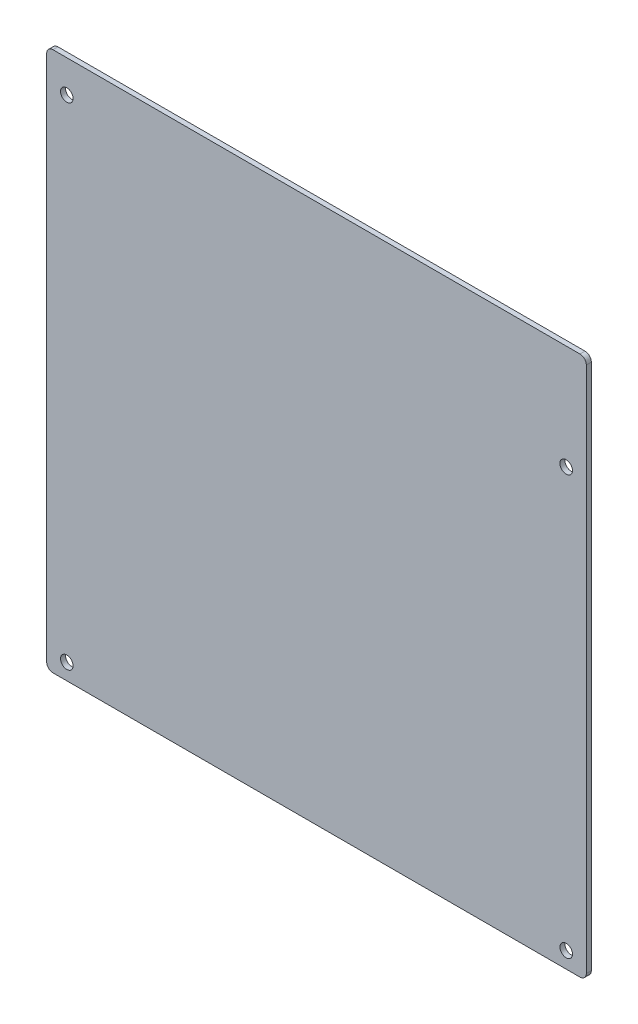
ISO-10303-21;
HEADER;
FILE_DESCRIPTION(('STEP AP214'),'2;1');
FILE_NAME('part.step','',(''),(''),'','','');
FILE_SCHEMA(('AUTOMOTIVE_DESIGN { 1 0 10303 214 1 1 1 1 }'));
ENDSEC;
DATA;
#1=APPLICATION_CONTEXT('core data for automotive mechanical design processes');
#2=APPLICATION_PROTOCOL_DEFINITION('international standard','automotive_design',2000,#1);
#3=PRODUCT_CONTEXT('',#1,'mechanical');
#4=PRODUCT('Part','Part','',(#3));
#5=PRODUCT_RELATED_PRODUCT_CATEGORY('part','',(#4));
#6=PRODUCT_DEFINITION_FORMATION('','',#4);
#7=PRODUCT_DEFINITION_CONTEXT('part definition',#1,'design');
#8=PRODUCT_DEFINITION('design','',#6,#7);
#9=PRODUCT_DEFINITION_SHAPE('','',#8);
#10=(LENGTH_UNIT() NAMED_UNIT(*) SI_UNIT(.MILLI.,.METRE.));
#11=(NAMED_UNIT(*) PLANE_ANGLE_UNIT() SI_UNIT($,.RADIAN.));
#12=(NAMED_UNIT(*) SI_UNIT($,.STERADIAN.) SOLID_ANGLE_UNIT());
#13=UNCERTAINTY_MEASURE_WITH_UNIT(LENGTH_MEASURE(1.E-05),#10,'distance_accuracy_value','');
#14=(GEOMETRIC_REPRESENTATION_CONTEXT(3) GLOBAL_UNCERTAINTY_ASSIGNED_CONTEXT((#13)) GLOBAL_UNIT_ASSIGNED_CONTEXT((#10,
#11,#12)) REPRESENTATION_CONTEXT('',''));
#15=CARTESIAN_POINT('',(0.,0.,0.));
#16=DIRECTION('',(0.,0.,1.));
#17=DIRECTION('',(1.,0.,0.));
#18=AXIS2_PLACEMENT_3D('',#15,#16,#17);
#19=CARTESIAN_POINT('',(-4.34999999999997,-3.08000000000002,-242.245864044653));
#20=DIRECTION('',(0.,0.,1.));
#21=DIRECTION('',(1.,0.,0.));
#22=AXIS2_PLACEMENT_3D('',#19,#20,#21);
#23=CYLINDRICAL_SURFACE('',#22,2.00000000000001);
#24=CARTESIAN_POINT('',(-4.34999999999997,-3.08000000000002,-1.57500000000005));
#25=DIRECTION('',(0.,0.,1.));
#26=DIRECTION('',(1.,0.,0.));
#27=AXIS2_PLACEMENT_3D('',#24,#25,#26);
#28=CIRCLE('',#27,2.00000000000001);
#29=CARTESIAN_POINT('',(-4.34999999999997,-5.08000000000002,-1.57500000000005));
#30=VERTEX_POINT('',#29);
#31=CARTESIAN_POINT('',(-6.34999999999998,-3.08000000000003,-1.57500000000005));
#32=VERTEX_POINT('',#31);
#33=EDGE_CURVE('E44',#30,#32,#28,.F.);
#34=ORIENTED_EDGE('',*,*,#33,.F.);
#35=DIRECTION('',(0.,0.,1.));
#36=VECTOR('',#35,1.);
#37=CARTESIAN_POINT('',(-4.34999999999997,-5.08000000000002,-242.245864044653));
#38=LINE('',#37,#36);
#39=CARTESIAN_POINT('',(-4.34999999999997,-5.08000000000002,0.));
#40=VERTEX_POINT('',#39);
#41=EDGE_CURVE('E119',#30,#40,#38,.T.);
#42=ORIENTED_EDGE('',*,*,#41,.T.);
#43=CARTESIAN_POINT('',(-4.34999999999997,-3.08000000000002,0.));
#44=DIRECTION('',(0.,0.,1.));
#45=DIRECTION('',(-1.,0.,0.));
#46=AXIS2_PLACEMENT_3D('',#43,#44,#45);
#47=CIRCLE('',#46,2.00000000000001);
#48=CARTESIAN_POINT('',(-6.34999999999998,-3.08000000000002,0.));
#49=VERTEX_POINT('',#48);
#50=EDGE_CURVE('E134',#49,#40,#47,.T.);
#51=ORIENTED_EDGE('',*,*,#50,.F.);
#52=DIRECTION('',(0.,0.,1.));
#53=VECTOR('',#52,1.);
#54=CARTESIAN_POINT('',(-6.34999999999998,-3.08000000000002,-242.245864044653));
#55=LINE('',#54,#53);
#56=EDGE_CURVE('E105',#32,#49,#55,.T.);
#57=ORIENTED_EDGE('',*,*,#56,.F.);
#58=EDGE_LOOP('',(#34,#42,#51,#57));
#59=FACE_BOUND('',#58,.T.);
#60=ADVANCED_FACE('F36',(#59),#23,.T.);
#61=CARTESIAN_POINT('',(-6.35,163.1,-242.245864044653));
#62=DIRECTION('',(-1.,0.,0.));
#63=DIRECTION('',(0.,-1.,0.));
#64=AXIS2_PLACEMENT_3D('',#61,#62,#63);
#65=PLANE('',#64);
#66=DIRECTION('',(0.,1.,0.));
#67=VECTOR('',#66,1.);
#68=CARTESIAN_POINT('',(-6.35,163.1,-1.57500000000005));
#69=LINE('',#68,#67);
#70=CARTESIAN_POINT('',(-6.35,163.1,-1.57500000000005));
#71=VERTEX_POINT('',#70);
#72=EDGE_CURVE('E82',#32,#71,#69,.T.);
#73=ORIENTED_EDGE('',*,*,#72,.F.);
#74=ORIENTED_EDGE('',*,*,#56,.T.);
#75=DIRECTION('',(0.,-1.,0.));
#76=VECTOR('',#75,1.);
#77=CARTESIAN_POINT('',(-6.35,163.1,0.));
#78=LINE('',#77,#76);
#79=CARTESIAN_POINT('',(-6.35,163.1,0.));
#80=VERTEX_POINT('',#79);
#81=EDGE_CURVE('E121',#80,#49,#78,.T.);
#82=ORIENTED_EDGE('',*,*,#81,.F.);
#83=DIRECTION('',(0.,0.,1.));
#84=VECTOR('',#83,1.);
#85=CARTESIAN_POINT('',(-6.35,163.1,-242.245864044653));
#86=LINE('',#85,#84);
#87=EDGE_CURVE('E103',#71,#80,#86,.T.);
#88=ORIENTED_EDGE('',*,*,#87,.F.);
#89=EDGE_LOOP('',(#73,#74,#82,#88));
#90=FACE_BOUND('',#89,.T.);
#91=ADVANCED_FACE('F205',(#90),#65,.T.);
#92=CARTESIAN_POINT('',(-4.35,163.1,-242.245864044653));
#93=DIRECTION('',(0.,0.,1.));
#94=DIRECTION('',(1.,0.,0.));
#95=AXIS2_PLACEMENT_3D('',#92,#93,#94);
#96=CYLINDRICAL_SURFACE('',#95,2.);
#97=CARTESIAN_POINT('',(-4.35,163.1,-1.57500000000005));
#98=DIRECTION('',(0.,0.,1.));
#99=DIRECTION('',(1.,0.,0.));
#100=AXIS2_PLACEMENT_3D('',#97,#98,#99);
#101=CIRCLE('',#100,2.);
#102=CARTESIAN_POINT('',(-4.34999999999999,165.1,-1.57500000000005));
#103=VERTEX_POINT('',#102);
#104=EDGE_CURVE('E78',#71,#103,#101,.F.);
#105=ORIENTED_EDGE('',*,*,#104,.F.);
#106=ORIENTED_EDGE('',*,*,#87,.T.);
#107=CARTESIAN_POINT('',(-4.35,163.1,0.));
#108=DIRECTION('',(0.,0.,1.));
#109=DIRECTION('',(1.,0.,0.));
#110=AXIS2_PLACEMENT_3D('',#107,#108,#109);
#111=CIRCLE('',#110,2.);
#112=CARTESIAN_POINT('',(-4.34999999999999,165.1,0.));
#113=VERTEX_POINT('',#112);
#114=EDGE_CURVE('E101',#113,#80,#111,.T.);
#115=ORIENTED_EDGE('',*,*,#114,.F.);
#116=DIRECTION('',(0.,0.,1.));
#117=VECTOR('',#116,1.);
#118=CARTESIAN_POINT('',(-4.34999999999999,165.1,-242.245864044653));
#119=LINE('',#118,#117);
#120=EDGE_CURVE('E94',#103,#113,#119,.T.);
#121=ORIENTED_EDGE('',*,*,#120,.F.);
#122=EDGE_LOOP('',(#105,#106,#115,#121));
#123=FACE_BOUND('',#122,.T.);
#124=ADVANCED_FACE('F99',(#123),#96,.T.);
#125=CARTESIAN_POINT('',(161.83,165.1,-242.245864044653));
#126=DIRECTION('',(0.,1.,0.));
#127=DIRECTION('',(0.,0.,1.));
#128=AXIS2_PLACEMENT_3D('',#125,#126,#127);
#129=PLANE('',#128);
#130=DIRECTION('',(1.,0.,0.));
#131=VECTOR('',#130,1.);
#132=CARTESIAN_POINT('',(161.83,165.1,-1.57500000000005));
#133=LINE('',#132,#131);
#134=CARTESIAN_POINT('',(161.83,165.1,-1.57500000000005));
#135=VERTEX_POINT('',#134);
#136=EDGE_CURVE('E81',#103,#135,#133,.T.);
#137=ORIENTED_EDGE('',*,*,#136,.F.);
#138=ORIENTED_EDGE('',*,*,#120,.T.);
#139=DIRECTION('',(-1.,0.,0.));
#140=VECTOR('',#139,1.);
#141=CARTESIAN_POINT('',(161.83,165.1,0.));
#142=LINE('',#141,#140);
#143=CARTESIAN_POINT('',(161.83,165.1,0.));
#144=VERTEX_POINT('',#143);
#145=EDGE_CURVE('E158',#144,#113,#142,.T.);
#146=ORIENTED_EDGE('',*,*,#145,.F.);
#147=DIRECTION('',(0.,0.,1.));
#148=VECTOR('',#147,1.);
#149=CARTESIAN_POINT('',(161.83,165.1,-242.245864044653));
#150=LINE('',#149,#148);
#151=EDGE_CURVE('E97',#135,#144,#150,.T.);
#152=ORIENTED_EDGE('',*,*,#151,.F.);
#153=EDGE_LOOP('',(#137,#138,#146,#152));
#154=FACE_BOUND('',#153,.T.);
#155=ADVANCED_FACE('F91',(#154),#129,.T.);
#156=CARTESIAN_POINT('',(161.83,163.1,-242.245864044653));
#157=DIRECTION('',(0.,0.,1.));
#158=DIRECTION('',(1.,0.,0.));
#159=AXIS2_PLACEMENT_3D('',#156,#157,#158);
#160=CYLINDRICAL_SURFACE('',#159,2.);
#161=CARTESIAN_POINT('',(161.83,163.1,-1.57500000000005));
#162=DIRECTION('',(0.,0.,1.));
#163=DIRECTION('',(1.,0.,0.));
#164=AXIS2_PLACEMENT_3D('',#161,#162,#163);
#165=CIRCLE('',#164,2.);
#166=CARTESIAN_POINT('',(163.83,163.1,-1.57500000000005));
#167=VERTEX_POINT('',#166);
#168=EDGE_CURVE('E58',#135,#167,#165,.F.);
#169=ORIENTED_EDGE('',*,*,#168,.F.);
#170=ORIENTED_EDGE('',*,*,#151,.T.);
#171=CARTESIAN_POINT('',(161.83,163.1,0.));
#172=DIRECTION('',(0.,0.,1.));
#173=DIRECTION('',(-1.,0.,0.));
#174=AXIS2_PLACEMENT_3D('',#171,#172,#173);
#175=CIRCLE('',#174,2.);
#176=CARTESIAN_POINT('',(163.83,163.1,0.));
#177=VERTEX_POINT('',#176);
#178=EDGE_CURVE('E155',#177,#144,#175,.T.);
#179=ORIENTED_EDGE('',*,*,#178,.F.);
#180=DIRECTION('',(0.,0.,1.));
#181=VECTOR('',#180,1.);
#182=CARTESIAN_POINT('',(163.83,163.1,-242.245864044653));
#183=LINE('',#182,#181);
#184=EDGE_CURVE('E107',#167,#177,#183,.T.);
#185=ORIENTED_EDGE('',*,*,#184,.F.);
#186=EDGE_LOOP('',(#169,#170,#179,#185));
#187=FACE_BOUND('',#186,.T.);
#188=ADVANCED_FACE('F231',(#187),#160,.T.);
#189=CARTESIAN_POINT('',(163.83,163.1,-242.245864044653));
#190=DIRECTION('',(1.,0.,0.));
#191=DIRECTION('',(0.,1.,0.));
#192=AXIS2_PLACEMENT_3D('',#189,#190,#191);
#193=PLANE('',#192);
#194=DIRECTION('',(0.,-1.,0.));
#195=VECTOR('',#194,1.);
#196=CARTESIAN_POINT('',(163.83,163.1,-1.57500000000005));
#197=LINE('',#196,#195);
#198=CARTESIAN_POINT('',(163.83,-3.08,-1.57500000000005));
#199=VERTEX_POINT('',#198);
#200=EDGE_CURVE('E52',#167,#199,#197,.T.);
#201=ORIENTED_EDGE('',*,*,#200,.F.);
#202=ORIENTED_EDGE('',*,*,#184,.T.);
#203=DIRECTION('',(0.,1.,0.));
#204=VECTOR('',#203,1.);
#205=CARTESIAN_POINT('',(163.83,163.1,0.));
#206=LINE('',#205,#204);
#207=CARTESIAN_POINT('',(163.83,-3.08,0.));
#208=VERTEX_POINT('',#207);
#209=EDGE_CURVE('E152',#208,#177,#206,.T.);
#210=ORIENTED_EDGE('',*,*,#209,.F.);
#211=DIRECTION('',(0.,0.,1.));
#212=VECTOR('',#211,1.);
#213=CARTESIAN_POINT('',(163.83,-3.08,-242.245864044653));
#214=LINE('',#213,#212);
#215=EDGE_CURVE('E113',#199,#208,#214,.T.);
#216=ORIENTED_EDGE('',*,*,#215,.F.);
#217=EDGE_LOOP('',(#201,#202,#210,#216));
#218=FACE_BOUND('',#217,.T.);
#219=ADVANCED_FACE('F233',(#218),#193,.T.);
#220=CARTESIAN_POINT('',(161.83,-3.08,-242.245864044653));
#221=DIRECTION('',(0.,0.,1.));
#222=DIRECTION('',(1.,0.,0.));
#223=AXIS2_PLACEMENT_3D('',#220,#221,#222);
#224=CYLINDRICAL_SURFACE('',#223,2.);
#225=CARTESIAN_POINT('',(161.83,-3.08,-1.57500000000005));
#226=DIRECTION('',(0.,0.,1.));
#227=DIRECTION('',(1.,0.,0.));
#228=AXIS2_PLACEMENT_3D('',#225,#226,#227);
#229=CIRCLE('',#228,2.);
#230=CARTESIAN_POINT('',(161.83,-5.08,-1.5750000000001));
#231=VERTEX_POINT('',#230);
#232=EDGE_CURVE('E162',#199,#231,#229,.F.);
#233=ORIENTED_EDGE('',*,*,#232,.F.);
#234=ORIENTED_EDGE('',*,*,#215,.T.);
#235=CARTESIAN_POINT('',(161.83,-3.08,0.));
#236=DIRECTION('',(0.,0.,1.));
#237=DIRECTION('',(-1.,0.,0.));
#238=AXIS2_PLACEMENT_3D('',#235,#236,#237);
#239=CIRCLE('',#238,2.);
#240=CARTESIAN_POINT('',(161.83,-5.08,0.));
#241=VERTEX_POINT('',#240);
#242=EDGE_CURVE('E145',#241,#208,#239,.T.);
#243=ORIENTED_EDGE('',*,*,#242,.F.);
#244=DIRECTION('',(0.,0.,1.));
#245=VECTOR('',#244,1.);
#246=CARTESIAN_POINT('',(161.83,-5.08,-242.245864044653));
#247=LINE('',#246,#245);
#248=EDGE_CURVE('E116',#231,#241,#247,.T.);
#249=ORIENTED_EDGE('',*,*,#248,.F.);
#250=EDGE_LOOP('',(#233,#234,#243,#249));
#251=FACE_BOUND('',#250,.T.);
#252=ADVANCED_FACE('F236',(#251),#224,.T.);
#253=CARTESIAN_POINT('',(161.83,-5.08,-242.245864044653));
#254=DIRECTION('',(0.,-1.,0.));
#255=DIRECTION('',(1.,0.,0.));
#256=AXIS2_PLACEMENT_3D('',#253,#254,#255);
#257=PLANE('',#256);
#258=DIRECTION('',(-1.,0.,0.));
#259=VECTOR('',#258,1.);
#260=CARTESIAN_POINT('',(161.83,-5.08,-1.57500000000005));
#261=LINE('',#260,#259);
#262=EDGE_CURVE('E11',#231,#30,#261,.T.);
#263=ORIENTED_EDGE('',*,*,#262,.F.);
#264=ORIENTED_EDGE('',*,*,#248,.T.);
#265=DIRECTION('',(1.,0.,0.));
#266=VECTOR('',#265,1.);
#267=CARTESIAN_POINT('',(161.83,-5.08,0.));
#268=LINE('',#267,#266);
#269=EDGE_CURVE('E138',#40,#241,#268,.T.);
#270=ORIENTED_EDGE('',*,*,#269,.F.);
#271=ORIENTED_EDGE('',*,*,#41,.F.);
#272=EDGE_LOOP('',(#263,#264,#270,#271));
#273=FACE_BOUND('',#272,.T.);
#274=ADVANCED_FACE('F189',(#273),#257,.T.);
#275=CARTESIAN_POINT('',(-4.34999999999997,-3.08000000000002,0.));
#276=DIRECTION('',(0.,0.,-1.));
#277=DIRECTION('',(-1.,0.,0.));
#278=AXIS2_PLACEMENT_3D('',#275,#276,#277);
#279=PLANE('',#278);
#280=CARTESIAN_POINT('',(0.,154.9199999892,0.));
#281=DIRECTION('',(0.,0.,1.));
#282=DIRECTION('',(1.,0.,0.));
#283=AXIS2_PLACEMENT_3D('',#280,#281,#282);
#284=CIRCLE('',#283,1.9749999997);
#285=CARTESIAN_POINT('',(1.9749999997,154.9199999892,0.));
#286=VERTEX_POINT('',#285);
#287=EDGE_CURVE('E174',#286,#286,#284,.T.);
#288=ORIENTED_EDGE('',*,*,#287,.F.);
#289=EDGE_LOOP('',(#288));
#290=FACE_BOUND('',#289,.T.);
#291=CARTESIAN_POINT('',(157.48,132.08,0.));
#292=DIRECTION('',(0.,0.,1.));
#293=DIRECTION('',(1.,0.,0.));
#294=AXIS2_PLACEMENT_3D('',#291,#292,#293);
#295=CIRCLE('',#294,1.97499999969999);
#296=CARTESIAN_POINT('',(159.4549999997,132.08,0.));
#297=VERTEX_POINT('',#296);
#298=EDGE_CURVE('E177',#297,#297,#295,.T.);
#299=ORIENTED_EDGE('',*,*,#298,.F.);
#300=EDGE_LOOP('',(#299));
#301=FACE_BOUND('',#300,.T.);
#302=CARTESIAN_POINT('',(157.48,0.,0.));
#303=DIRECTION('',(0.,0.,1.));
#304=DIRECTION('',(1.,0.,0.));
#305=AXIS2_PLACEMENT_3D('',#302,#303,#304);
#306=CIRCLE('',#305,1.97499999969999);
#307=CARTESIAN_POINT('',(159.4549999997,0.,0.));
#308=VERTEX_POINT('',#307);
#309=EDGE_CURVE('E173',#308,#308,#306,.T.);
#310=ORIENTED_EDGE('',*,*,#309,.F.);
#311=EDGE_LOOP('',(#310));
#312=FACE_BOUND('',#311,.T.);
#313=CARTESIAN_POINT('',(0.,0.,0.));
#314=DIRECTION('',(0.,0.,1.));
#315=DIRECTION('',(1.,0.,0.));
#316=AXIS2_PLACEMENT_3D('',#313,#314,#315);
#317=CIRCLE('',#316,1.9749999997);
#318=CARTESIAN_POINT('',(1.9749999997,0.,0.));
#319=VERTEX_POINT('',#318);
#320=EDGE_CURVE('E127',#319,#319,#317,.T.);
#321=ORIENTED_EDGE('',*,*,#320,.F.);
#322=EDGE_LOOP('',(#321));
#323=FACE_BOUND('',#322,.T.);
#324=ORIENTED_EDGE('',*,*,#50,.T.);
#325=ORIENTED_EDGE('',*,*,#269,.T.);
#326=ORIENTED_EDGE('',*,*,#242,.T.);
#327=ORIENTED_EDGE('',*,*,#209,.T.);
#328=ORIENTED_EDGE('',*,*,#178,.T.);
#329=ORIENTED_EDGE('',*,*,#145,.T.);
#330=ORIENTED_EDGE('',*,*,#114,.T.);
#331=ORIENTED_EDGE('',*,*,#81,.T.);
#332=EDGE_LOOP('',(#324,#325,#326,#327,#328,#329,#330,#331));
#333=FACE_BOUND('',#332,.T.);
#334=ADVANCED_FACE('F186',(#290,#301,#312,#323,#333),#279,.F.);
#335=CARTESIAN_POINT('',(0.,0.,-1.57500000000005));
#336=DIRECTION('',(0.,0.,1.));
#337=DIRECTION('',(1.,0.,0.));
#338=AXIS2_PLACEMENT_3D('',#335,#336,#337);
#339=PLANE('',#338);
#340=CARTESIAN_POINT('',(0.,154.9199999892,-1.57500000000005));
#341=DIRECTION('',(0.,0.,1.));
#342=DIRECTION('',(1.,0.,0.));
#343=AXIS2_PLACEMENT_3D('',#340,#341,#342);
#344=CIRCLE('',#343,1.9749999997);
#345=CARTESIAN_POINT('',(1.9749999997,154.9199999892,-1.57500000000005));
#346=VERTEX_POINT('',#345);
#347=EDGE_CURVE('E39',#346,#346,#344,.T.);
#348=ORIENTED_EDGE('',*,*,#347,.T.);
#349=EDGE_LOOP('',(#348));
#350=FACE_BOUND('',#349,.T.);
#351=CARTESIAN_POINT('',(157.48,132.08,-1.57500000000005));
#352=DIRECTION('',(0.,0.,1.));
#353=DIRECTION('',(1.,0.,0.));
#354=AXIS2_PLACEMENT_3D('',#351,#352,#353);
#355=CIRCLE('',#354,1.97499999969999);
#356=CARTESIAN_POINT('',(159.4549999997,132.08,-1.57500000000005));
#357=VERTEX_POINT('',#356);
#358=EDGE_CURVE('E129',#357,#357,#355,.T.);
#359=ORIENTED_EDGE('',*,*,#358,.T.);
#360=EDGE_LOOP('',(#359));
#361=FACE_BOUND('',#360,.T.);
#362=CARTESIAN_POINT('',(157.48,0.,-1.57500000000005));
#363=DIRECTION('',(0.,0.,1.));
#364=DIRECTION('',(1.,0.,0.));
#365=AXIS2_PLACEMENT_3D('',#362,#363,#364);
#366=CIRCLE('',#365,1.97499999969999);
#367=CARTESIAN_POINT('',(159.4549999997,0.,-1.57500000000005));
#368=VERTEX_POINT('',#367);
#369=EDGE_CURVE('E126',#368,#368,#366,.T.);
#370=ORIENTED_EDGE('',*,*,#369,.T.);
#371=EDGE_LOOP('',(#370));
#372=FACE_BOUND('',#371,.T.);
#373=CARTESIAN_POINT('',(0.,0.,-1.57500000000005));
#374=DIRECTION('',(0.,0.,1.));
#375=DIRECTION('',(1.,0.,0.));
#376=AXIS2_PLACEMENT_3D('',#373,#374,#375);
#377=CIRCLE('',#376,1.9749999997);
#378=CARTESIAN_POINT('',(1.9749999997,0.,-1.57500000000005));
#379=VERTEX_POINT('',#378);
#380=EDGE_CURVE('E123',#379,#379,#377,.T.);
#381=ORIENTED_EDGE('',*,*,#380,.T.);
#382=EDGE_LOOP('',(#381));
#383=FACE_BOUND('',#382,.T.);
#384=ORIENTED_EDGE('',*,*,#33,.T.);
#385=ORIENTED_EDGE('',*,*,#72,.T.);
#386=ORIENTED_EDGE('',*,*,#104,.T.);
#387=ORIENTED_EDGE('',*,*,#136,.T.);
#388=ORIENTED_EDGE('',*,*,#168,.T.);
#389=ORIENTED_EDGE('',*,*,#200,.T.);
#390=ORIENTED_EDGE('',*,*,#232,.T.);
#391=ORIENTED_EDGE('',*,*,#262,.T.);
#392=EDGE_LOOP('',(#384,#385,#386,#387,#388,#389,#390,#391));
#393=FACE_BOUND('',#392,.T.);
#394=ADVANCED_FACE('F80',(#350,#361,#372,#383,#393),#339,.F.);
#395=CARTESIAN_POINT('',(0.,0.,-10.));
#396=DIRECTION('',(0.,0.,1.));
#397=DIRECTION('',(1.,0.,0.));
#398=AXIS2_PLACEMENT_3D('',#395,#396,#397);
#399=CYLINDRICAL_SURFACE('',#398,1.9749999997);
#400=ORIENTED_EDGE('',*,*,#320,.T.);
#401=EDGE_LOOP('',(#400));
#402=FACE_BOUND('',#401,.T.);
#403=ORIENTED_EDGE('',*,*,#380,.F.);
#404=EDGE_LOOP('',(#403));
#405=FACE_BOUND('',#404,.T.);
#406=ADVANCED_FACE('F194',(#402,#405),#399,.F.);
#407=CARTESIAN_POINT('',(157.48,0.,-10.));
#408=DIRECTION('',(0.,0.,1.));
#409=DIRECTION('',(1.,0.,0.));
#410=AXIS2_PLACEMENT_3D('',#407,#408,#409);
#411=CYLINDRICAL_SURFACE('',#410,1.97499999969999);
#412=ORIENTED_EDGE('',*,*,#309,.T.);
#413=EDGE_LOOP('',(#412));
#414=FACE_BOUND('',#413,.T.);
#415=ORIENTED_EDGE('',*,*,#369,.F.);
#416=EDGE_LOOP('',(#415));
#417=FACE_BOUND('',#416,.T.);
#418=ADVANCED_FACE('F183',(#414,#417),#411,.F.);
#419=CARTESIAN_POINT('',(157.48,132.08,-10.));
#420=DIRECTION('',(0.,0.,1.));
#421=DIRECTION('',(1.,0.,0.));
#422=AXIS2_PLACEMENT_3D('',#419,#420,#421);
#423=CYLINDRICAL_SURFACE('',#422,1.97499999969999);
#424=ORIENTED_EDGE('',*,*,#298,.T.);
#425=EDGE_LOOP('',(#424));
#426=FACE_BOUND('',#425,.T.);
#427=ORIENTED_EDGE('',*,*,#358,.F.);
#428=EDGE_LOOP('',(#427));
#429=FACE_BOUND('',#428,.T.);
#430=ADVANCED_FACE('F302',(#426,#429),#423,.F.);
#431=CARTESIAN_POINT('',(0.,154.9199999892,-10.));
#432=DIRECTION('',(0.,0.,1.));
#433=DIRECTION('',(1.,0.,0.));
#434=AXIS2_PLACEMENT_3D('',#431,#432,#433);
#435=CYLINDRICAL_SURFACE('',#434,1.9749999997);
#436=ORIENTED_EDGE('',*,*,#287,.T.);
#437=EDGE_LOOP('',(#436));
#438=FACE_BOUND('',#437,.T.);
#439=ORIENTED_EDGE('',*,*,#347,.F.);
#440=EDGE_LOOP('',(#439));
#441=FACE_BOUND('',#440,.T.);
#442=ADVANCED_FACE('F311',(#438,#441),#435,.F.);
#443=CLOSED_SHELL('',(#60,#91,#124,#155,#188,#219,#252,#274,#334,#394,#406,#418,#430,#442));
#444=MANIFOLD_SOLID_BREP('B2',#443);
#445=ADVANCED_BREP_SHAPE_REPRESENTATION('',(#18,#444),#14);
#446=SHAPE_DEFINITION_REPRESENTATION(#9,#445);
ENDSEC;
END-ISO-10303-21;
